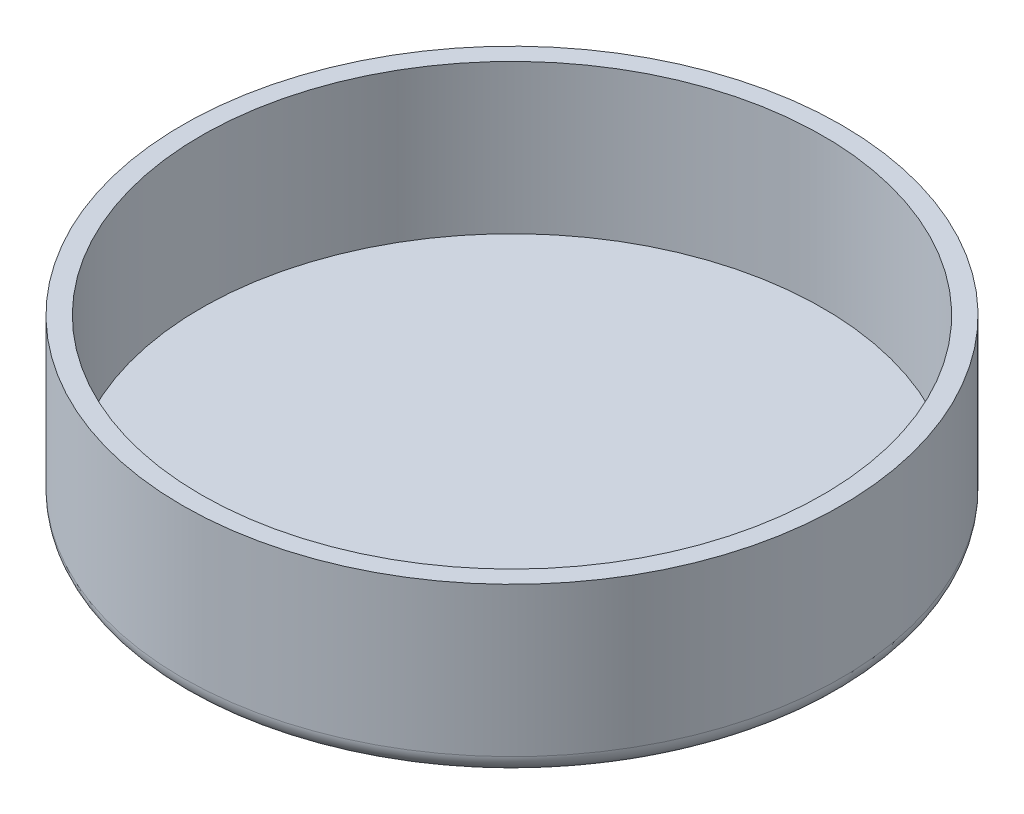
ISO-10303-21;
HEADER;
FILE_DESCRIPTION(('STEP AP214'),'2;1');
FILE_NAME('part.step','',(''),(''),'','','');
FILE_SCHEMA(('AUTOMOTIVE_DESIGN { 1 0 10303 214 1 1 1 1 }'));
ENDSEC;
DATA;
#1=APPLICATION_CONTEXT('core data for automotive mechanical design processes');
#2=APPLICATION_PROTOCOL_DEFINITION('international standard','automotive_design',2000,#1);
#3=PRODUCT_CONTEXT('',#1,'mechanical');
#4=PRODUCT('Part','Part','',(#3));
#5=PRODUCT_RELATED_PRODUCT_CATEGORY('part','',(#4));
#6=PRODUCT_DEFINITION_FORMATION('','',#4);
#7=PRODUCT_DEFINITION_CONTEXT('part definition',#1,'design');
#8=PRODUCT_DEFINITION('design','',#6,#7);
#9=PRODUCT_DEFINITION_SHAPE('','',#8);
#10=(LENGTH_UNIT() NAMED_UNIT(*) SI_UNIT(.MILLI.,.METRE.));
#11=(NAMED_UNIT(*) PLANE_ANGLE_UNIT() SI_UNIT($,.RADIAN.));
#12=(NAMED_UNIT(*) SI_UNIT($,.STERADIAN.) SOLID_ANGLE_UNIT());
#13=UNCERTAINTY_MEASURE_WITH_UNIT(LENGTH_MEASURE(1.E-05),#10,'distance_accuracy_value','');
#14=(GEOMETRIC_REPRESENTATION_CONTEXT(3) GLOBAL_UNCERTAINTY_ASSIGNED_CONTEXT((#13)) GLOBAL_UNIT_ASSIGNED_CONTEXT((#10,
#11,#12)) REPRESENTATION_CONTEXT('',''));
#15=CARTESIAN_POINT('',(0.,0.,0.));
#16=DIRECTION('',(0.,0.,1.));
#17=DIRECTION('',(1.,0.,0.));
#18=AXIS2_PLACEMENT_3D('',#15,#16,#17);
#19=CARTESIAN_POINT('',(0.,27.,0.));
#20=DIRECTION('',(0.,1.,0.));
#21=DIRECTION('',(0.,0.,1.));
#22=AXIS2_PLACEMENT_3D('',#19,#20,#21);
#23=PLANE('',#22);
#24=CARTESIAN_POINT('',(0.,27.,0.));
#25=DIRECTION('',(0.,1.,0.));
#26=DIRECTION('',(0.,0.,1.));
#27=AXIS2_PLACEMENT_3D('',#24,#25,#26);
#28=CIRCLE('',#27,53.);
#29=CARTESIAN_POINT('',(0.,27.,53.));
#30=VERTEX_POINT('',#29);
#31=EDGE_CURVE('E45',#30,#30,#28,.T.);
#32=ORIENTED_EDGE('',*,*,#31,.T.);
#33=EDGE_LOOP('',(#32));
#34=FACE_BOUND('',#33,.T.);
#35=CARTESIAN_POINT('',(0.,27.,0.));
#36=DIRECTION('',(0.,1.,0.));
#37=DIRECTION('',(0.,0.,1.));
#38=AXIS2_PLACEMENT_3D('',#35,#36,#37);
#39=CIRCLE('',#38,50.);
#40=CARTESIAN_POINT('',(0.,27.,50.));
#41=VERTEX_POINT('',#40);
#42=EDGE_CURVE('E50',#41,#41,#39,.T.);
#43=ORIENTED_EDGE('',*,*,#42,.F.);
#44=EDGE_LOOP('',(#43));
#45=FACE_BOUND('',#44,.T.);
#46=ADVANCED_FACE('F30',(#34,#45),#23,.T.);
#47=CARTESIAN_POINT('',(0.,0.,0.));
#48=DIRECTION('',(0.,1.,0.));
#49=DIRECTION('',(0.,0.,1.));
#50=AXIS2_PLACEMENT_3D('',#47,#48,#49);
#51=PLANE('',#50);
#52=CARTESIAN_POINT('',(0.,0.,0.));
#53=DIRECTION('',(0.,1.,0.));
#54=DIRECTION('',(0.,0.,1.));
#55=AXIS2_PLACEMENT_3D('',#52,#53,#54);
#56=CIRCLE('',#55,50.);
#57=CARTESIAN_POINT('',(0.,0.,50.));
#58=VERTEX_POINT('',#57);
#59=EDGE_CURVE('E10',#58,#58,#56,.F.);
#60=ORIENTED_EDGE('',*,*,#59,.T.);
#61=EDGE_LOOP('',(#60));
#62=FACE_BOUND('',#61,.T.);
#63=ADVANCED_FACE('F57',(#62),#51,.F.);
#64=CARTESIAN_POINT('',(0.,27.,0.));
#65=DIRECTION('',(0.,-1.,0.));
#66=DIRECTION('',(0.,0.,-1.));
#67=AXIS2_PLACEMENT_3D('',#64,#65,#66);
#68=CYLINDRICAL_SURFACE('',#67,53.);
#69=CARTESIAN_POINT('',(0.,3.,0.));
#70=DIRECTION('',(0.,1.,0.));
#71=DIRECTION('',(0.,0.,1.));
#72=AXIS2_PLACEMENT_3D('',#69,#70,#71);
#73=CIRCLE('',#72,53.);
#74=CARTESIAN_POINT('',(0.,3.,53.));
#75=VERTEX_POINT('',#74);
#76=EDGE_CURVE('E37',#75,#75,#73,.T.);
#77=ORIENTED_EDGE('',*,*,#76,.T.);
#78=EDGE_LOOP('',(#77));
#79=FACE_BOUND('',#78,.T.);
#80=ORIENTED_EDGE('',*,*,#31,.F.);
#81=EDGE_LOOP('',(#80));
#82=FACE_BOUND('',#81,.T.);
#83=ADVANCED_FACE('F63',(#79,#82),#68,.T.);
#84=CARTESIAN_POINT('',(0.,27.,0.));
#85=DIRECTION('',(0.,-1.,0.));
#86=DIRECTION('',(0.,0.,-1.));
#87=AXIS2_PLACEMENT_3D('',#84,#85,#86);
#88=CYLINDRICAL_SURFACE('',#87,50.);
#89=CARTESIAN_POINT('',(0.,3.,0.));
#90=DIRECTION('',(0.,1.,0.));
#91=DIRECTION('',(0.,0.,1.));
#92=AXIS2_PLACEMENT_3D('',#89,#90,#91);
#93=CIRCLE('',#92,50.);
#94=CARTESIAN_POINT('',(0.,3.,50.));
#95=VERTEX_POINT('',#94);
#96=EDGE_CURVE('E41',#95,#95,#93,.T.);
#97=ORIENTED_EDGE('',*,*,#96,.F.);
#98=EDGE_LOOP('',(#97));
#99=FACE_BOUND('',#98,.T.);
#100=ORIENTED_EDGE('',*,*,#42,.T.);
#101=EDGE_LOOP('',(#100));
#102=FACE_BOUND('',#101,.T.);
#103=ADVANCED_FACE('F54',(#99,#102),#88,.F.);
#104=CARTESIAN_POINT('',(0.,3.,0.));
#105=DIRECTION('',(0.,1.,0.));
#106=DIRECTION('',(0.,0.,1.));
#107=AXIS2_PLACEMENT_3D('',#104,#105,#106);
#108=PLANE('',#107);
#109=ORIENTED_EDGE('',*,*,#96,.T.);
#110=EDGE_LOOP('',(#109));
#111=FACE_BOUND('',#110,.T.);
#112=ADVANCED_FACE('F71',(#111),#108,.T.);
#113=CARTESIAN_POINT('',(0.,3.,0.));
#114=DIRECTION('',(0.,1.,0.));
#115=DIRECTION('',(0.,0.,1.));
#116=AXIS2_PLACEMENT_3D('',#113,#114,#115);
#117=TOROIDAL_SURFACE('',#116,50.,3.);
#118=ORIENTED_EDGE('',*,*,#59,.F.);
#119=EDGE_LOOP('',(#118));
#120=FACE_BOUND('',#119,.T.);
#121=ORIENTED_EDGE('',*,*,#76,.F.);
#122=EDGE_LOOP('',(#121));
#123=FACE_BOUND('',#122,.T.);
#124=ADVANCED_FACE('F32',(#120,#123),#117,.T.);
#125=CLOSED_SHELL('',(#46,#63,#83,#103,#112,#124));
#126=MANIFOLD_SOLID_BREP('B2',#125);
#127=ADVANCED_BREP_SHAPE_REPRESENTATION('',(#18,#126),#14);
#128=SHAPE_DEFINITION_REPRESENTATION(#9,#127);
ENDSEC;
END-ISO-10303-21;
